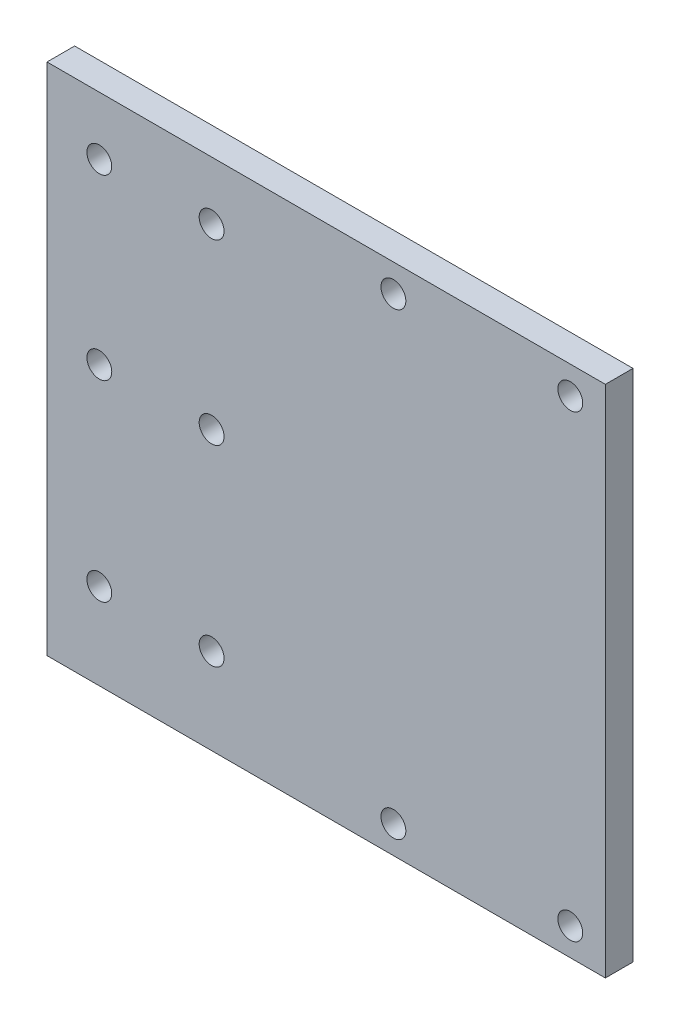
ISO-10303-21;
HEADER;
FILE_DESCRIPTION(('STEP AP214'),'2;1');
FILE_NAME('part.step','',(''),(''),'','','');
FILE_SCHEMA(('AUTOMOTIVE_DESIGN { 1 0 10303 214 1 1 1 1 }'));
ENDSEC;
DATA;
#1=APPLICATION_CONTEXT('core data for automotive mechanical design processes');
#2=APPLICATION_PROTOCOL_DEFINITION('international standard','automotive_design',2000,#1);
#3=PRODUCT_CONTEXT('',#1,'mechanical');
#4=PRODUCT('Part','Part','',(#3));
#5=PRODUCT_RELATED_PRODUCT_CATEGORY('part','',(#4));
#6=PRODUCT_DEFINITION_FORMATION('','',#4);
#7=PRODUCT_DEFINITION_CONTEXT('part definition',#1,'design');
#8=PRODUCT_DEFINITION('design','',#6,#7);
#9=PRODUCT_DEFINITION_SHAPE('','',#8);
#10=(LENGTH_UNIT() NAMED_UNIT(*) SI_UNIT(.MILLI.,.METRE.));
#11=(NAMED_UNIT(*) PLANE_ANGLE_UNIT() SI_UNIT($,.RADIAN.));
#12=(NAMED_UNIT(*) SI_UNIT($,.STERADIAN.) SOLID_ANGLE_UNIT());
#13=UNCERTAINTY_MEASURE_WITH_UNIT(LENGTH_MEASURE(1.E-05),#10,'distance_accuracy_value','');
#14=(GEOMETRIC_REPRESENTATION_CONTEXT(3) GLOBAL_UNCERTAINTY_ASSIGNED_CONTEXT((#13)) GLOBAL_UNIT_ASSIGNED_CONTEXT((#10,
#11,#12)) REPRESENTATION_CONTEXT('',''));
#15=CARTESIAN_POINT('',(0.,0.,0.));
#16=DIRECTION('',(0.,0.,1.));
#17=DIRECTION('',(1.,0.,0.));
#18=AXIS2_PLACEMENT_3D('',#15,#16,#17);
#19=CARTESIAN_POINT('',(0.,0.,5.));
#20=DIRECTION('',(0.,0.,-1.));
#21=DIRECTION('',(-1.,0.,0.));
#22=AXIS2_PLACEMENT_3D('',#19,#20,#21);
#23=PLANE('',#22);
#24=CARTESIAN_POINT('',(-20.7231298925779,-30.9129397601859,5.));
#25=DIRECTION('',(0.,0.,1.));
#26=DIRECTION('',(1.,0.,0.));
#27=AXIS2_PLACEMENT_3D('',#24,#25,#26);
#28=CIRCLE('',#27,2.24999999999999);
#29=CARTESIAN_POINT('',(-18.4731298925779,-30.9129397601859,5.));
#30=VERTEX_POINT('',#29);
#31=EDGE_CURVE('E166',#30,#30,#28,.T.);
#32=ORIENTED_EDGE('',*,*,#31,.F.);
#33=EDGE_LOOP('',(#32));
#34=FACE_BOUND('',#33,.T.);
#35=CARTESIAN_POINT('',(-20.7231298925779,3.80346419902011,5.));
#36=DIRECTION('',(0.,0.,1.));
#37=DIRECTION('',(1.,0.,0.));
#38=AXIS2_PLACEMENT_3D('',#35,#36,#37);
#39=CIRCLE('',#38,2.24999999999999);
#40=CARTESIAN_POINT('',(-18.4731298925779,3.80346419902011,5.));
#41=VERTEX_POINT('',#40);
#42=EDGE_CURVE('E160',#41,#41,#39,.T.);
#43=ORIENTED_EDGE('',*,*,#42,.F.);
#44=EDGE_LOOP('',(#43));
#45=FACE_BOUND('',#44,.T.);
#46=CARTESIAN_POINT('',(-41.0358215426072,3.80346419902011,5.));
#47=DIRECTION('',(0.,0.,1.));
#48=DIRECTION('',(1.,0.,0.));
#49=AXIS2_PLACEMENT_3D('',#46,#47,#48);
#50=CIRCLE('',#49,2.24999999999999);
#51=CARTESIAN_POINT('',(-38.7858215426072,3.80346419902011,5.));
#52=VERTEX_POINT('',#51);
#53=EDGE_CURVE('E154',#52,#52,#50,.T.);
#54=ORIENTED_EDGE('',*,*,#53,.F.);
#55=EDGE_LOOP('',(#54));
#56=FACE_BOUND('',#55,.T.);
#57=CARTESIAN_POINT('',(-41.0358215426072,-30.9129397601859,5.));
#58=DIRECTION('',(0.,0.,1.));
#59=DIRECTION('',(1.,0.,0.));
#60=AXIS2_PLACEMENT_3D('',#57,#58,#59);
#61=CIRCLE('',#60,2.24999999999999);
#62=CARTESIAN_POINT('',(-38.7858215426072,-30.9129397601859,5.));
#63=VERTEX_POINT('',#62);
#64=EDGE_CURVE('E148',#63,#63,#61,.T.);
#65=ORIENTED_EDGE('',*,*,#64,.F.);
#66=EDGE_LOOP('',(#65));
#67=FACE_BOUND('',#66,.T.);
#68=CARTESIAN_POINT('',(-41.0358215426072,35.9837671610475,5.));
#69=DIRECTION('',(0.,0.,1.));
#70=DIRECTION('',(1.,0.,0.));
#71=AXIS2_PLACEMENT_3D('',#68,#69,#70);
#72=CIRCLE('',#71,2.24999999999999);
#73=CARTESIAN_POINT('',(-38.7858215426072,35.9837671610475,5.));
#74=VERTEX_POINT('',#73);
#75=EDGE_CURVE('E142',#74,#74,#72,.T.);
#76=ORIENTED_EDGE('',*,*,#75,.F.);
#77=EDGE_LOOP('',(#76));
#78=FACE_BOUND('',#77,.T.);
#79=CARTESIAN_POINT('',(-20.7231298925779,35.9837671610475,5.));
#80=DIRECTION('',(0.,0.,1.));
#81=DIRECTION('',(1.,0.,0.));
#82=AXIS2_PLACEMENT_3D('',#79,#80,#81);
#83=CIRCLE('',#82,2.24999999999999);
#84=CARTESIAN_POINT('',(-18.4731298925779,35.9837671610475,5.));
#85=VERTEX_POINT('',#84);
#86=EDGE_CURVE('E136',#85,#85,#83,.T.);
#87=ORIENTED_EDGE('',*,*,#86,.F.);
#88=EDGE_LOOP('',(#87));
#89=FACE_BOUND('',#88,.T.);
#90=CARTESIAN_POINT('',(44.1578799463812,41.5000000000011,5.));
#91=DIRECTION('',(0.,0.,1.));
#92=DIRECTION('',(1.,0.,0.));
#93=AXIS2_PLACEMENT_3D('',#90,#91,#92);
#94=CIRCLE('',#93,2.25);
#95=CARTESIAN_POINT('',(46.4078799463812,41.5000000000011,5.));
#96=VERTEX_POINT('',#95);
#97=EDGE_CURVE('E130',#96,#96,#94,.T.);
#98=ORIENTED_EDGE('',*,*,#97,.F.);
#99=EDGE_LOOP('',(#98));
#100=FACE_BOUND('',#99,.T.);
#101=CARTESIAN_POINT('',(12.1578799463812,41.5000000000011,5.));
#102=DIRECTION('',(0.,0.,1.));
#103=DIRECTION('',(1.,0.,0.));
#104=AXIS2_PLACEMENT_3D('',#101,#102,#103);
#105=CIRCLE('',#104,2.25);
#106=CARTESIAN_POINT('',(14.4078799463812,41.5000000000011,5.));
#107=VERTEX_POINT('',#106);
#108=EDGE_CURVE('E124',#107,#107,#105,.T.);
#109=ORIENTED_EDGE('',*,*,#108,.F.);
#110=EDGE_LOOP('',(#109));
#111=FACE_BOUND('',#110,.T.);
#112=CARTESIAN_POINT('',(12.1578799463812,-41.4999999999988,5.));
#113=DIRECTION('',(0.,0.,1.));
#114=DIRECTION('',(1.,0.,0.));
#115=AXIS2_PLACEMENT_3D('',#112,#113,#114);
#116=CIRCLE('',#115,2.25);
#117=CARTESIAN_POINT('',(14.4078799463812,-41.4999999999988,5.));
#118=VERTEX_POINT('',#117);
#119=EDGE_CURVE('E118',#118,#118,#116,.T.);
#120=ORIENTED_EDGE('',*,*,#119,.F.);
#121=EDGE_LOOP('',(#120));
#122=FACE_BOUND('',#121,.T.);
#123=DIRECTION('',(0.,1.,0.));
#124=VECTOR('',#123,1.);
#125=CARTESIAN_POINT('',(50.5,-46.5,5.));
#126=LINE('',#125,#124);
#127=CARTESIAN_POINT('',(50.5,-46.5,5.));
#128=VERTEX_POINT('',#127);
#129=CARTESIAN_POINT('',(50.5,46.5,5.));
#130=VERTEX_POINT('',#129);
#131=EDGE_CURVE('E84',#128,#130,#126,.T.);
#132=ORIENTED_EDGE('',*,*,#131,.T.);
#133=DIRECTION('',(-1.,0.,0.));
#134=VECTOR('',#133,1.);
#135=CARTESIAN_POINT('',(-50.5,46.5,5.));
#136=LINE('',#135,#134);
#137=CARTESIAN_POINT('',(-50.5,46.5,5.));
#138=VERTEX_POINT('',#137);
#139=EDGE_CURVE('E79',#130,#138,#136,.T.);
#140=ORIENTED_EDGE('',*,*,#139,.T.);
#141=DIRECTION('',(0.,-1.,0.));
#142=VECTOR('',#141,1.);
#143=CARTESIAN_POINT('',(-50.5,-46.5,5.));
#144=LINE('',#143,#142);
#145=CARTESIAN_POINT('',(-50.5,-46.5,5.));
#146=VERTEX_POINT('',#145);
#147=EDGE_CURVE('E82',#138,#146,#144,.T.);
#148=ORIENTED_EDGE('',*,*,#147,.T.);
#149=DIRECTION('',(1.,0.,0.));
#150=VECTOR('',#149,1.);
#151=CARTESIAN_POINT('',(-50.5,-46.5,5.));
#152=LINE('',#151,#150);
#153=EDGE_CURVE('E49',#146,#128,#152,.T.);
#154=ORIENTED_EDGE('',*,*,#153,.T.);
#155=EDGE_LOOP('',(#132,#140,#148,#154));
#156=FACE_BOUND('',#155,.T.);
#157=CARTESIAN_POINT('',(44.1578799463812,-41.4999999999988,5.));
#158=DIRECTION('',(0.,0.,1.));
#159=DIRECTION('',(1.,0.,0.));
#160=AXIS2_PLACEMENT_3D('',#157,#158,#159);
#161=CIRCLE('',#160,2.25);
#162=CARTESIAN_POINT('',(46.4078799463812,-41.4999999999988,5.));
#163=VERTEX_POINT('',#162);
#164=EDGE_CURVE('E112',#163,#163,#161,.T.);
#165=ORIENTED_EDGE('',*,*,#164,.F.);
#166=EDGE_LOOP('',(#165));
#167=FACE_BOUND('',#166,.T.);
#168=ADVANCED_FACE('F32',(#34,#45,#56,#67,#78,#89,#100,#111,#122,#156,#167),#23,.F.);
#169=CARTESIAN_POINT('',(50.5,-46.5,5.));
#170=DIRECTION('',(-1.,0.,0.));
#171=DIRECTION('',(0.,0.,1.));
#172=AXIS2_PLACEMENT_3D('',#169,#170,#171);
#173=PLANE('',#172);
#174=DIRECTION('',(0.,1.,0.));
#175=VECTOR('',#174,1.);
#176=CARTESIAN_POINT('',(50.5,-46.5,0.));
#177=LINE('',#176,#175);
#178=CARTESIAN_POINT('',(50.5,-46.5,0.));
#179=VERTEX_POINT('',#178);
#180=CARTESIAN_POINT('',(50.5,46.5,0.));
#181=VERTEX_POINT('',#180);
#182=EDGE_CURVE('E96',#179,#181,#177,.T.);
#183=ORIENTED_EDGE('',*,*,#182,.T.);
#184=DIRECTION('',(0.,0.,-1.));
#185=VECTOR('',#184,1.);
#186=CARTESIAN_POINT('',(50.5,46.5,5.));
#187=LINE('',#186,#185);
#188=EDGE_CURVE('E11',#130,#181,#187,.T.);
#189=ORIENTED_EDGE('',*,*,#188,.F.);
#190=ORIENTED_EDGE('',*,*,#131,.F.);
#191=DIRECTION('',(0.,0.,-1.));
#192=VECTOR('',#191,1.);
#193=CARTESIAN_POINT('',(50.5,-46.5,5.));
#194=LINE('',#193,#192);
#195=EDGE_CURVE('E92',#128,#179,#194,.T.);
#196=ORIENTED_EDGE('',*,*,#195,.T.);
#197=EDGE_LOOP('',(#183,#189,#190,#196));
#198=FACE_BOUND('',#197,.T.);
#199=ADVANCED_FACE('F34',(#198),#173,.F.);
#200=CARTESIAN_POINT('',(-50.5,46.5,5.));
#201=DIRECTION('',(0.,-1.,0.));
#202=DIRECTION('',(0.,0.,-1.));
#203=AXIS2_PLACEMENT_3D('',#200,#201,#202);
#204=PLANE('',#203);
#205=DIRECTION('',(-1.,0.,0.));
#206=VECTOR('',#205,1.);
#207=CARTESIAN_POINT('',(-50.5,46.5,0.));
#208=LINE('',#207,#206);
#209=CARTESIAN_POINT('',(-50.5,46.5,0.));
#210=VERTEX_POINT('',#209);
#211=EDGE_CURVE('E88',#181,#210,#208,.T.);
#212=ORIENTED_EDGE('',*,*,#211,.T.);
#213=DIRECTION('',(0.,0.,-1.));
#214=VECTOR('',#213,1.);
#215=CARTESIAN_POINT('',(-50.5,46.5,5.));
#216=LINE('',#215,#214);
#217=EDGE_CURVE('E41',#138,#210,#216,.T.);
#218=ORIENTED_EDGE('',*,*,#217,.F.);
#219=ORIENTED_EDGE('',*,*,#139,.F.);
#220=ORIENTED_EDGE('',*,*,#188,.T.);
#221=EDGE_LOOP('',(#212,#218,#219,#220));
#222=FACE_BOUND('',#221,.T.);
#223=ADVANCED_FACE('F87',(#222),#204,.F.);
#224=CARTESIAN_POINT('',(-50.5,-46.5,5.));
#225=DIRECTION('',(1.,0.,0.));
#226=DIRECTION('',(0.,0.,-1.));
#227=AXIS2_PLACEMENT_3D('',#224,#225,#226);
#228=PLANE('',#227);
#229=DIRECTION('',(0.,-1.,0.));
#230=VECTOR('',#229,1.);
#231=CARTESIAN_POINT('',(-50.5,-46.5,0.));
#232=LINE('',#231,#230);
#233=CARTESIAN_POINT('',(-50.5,-46.5,0.));
#234=VERTEX_POINT('',#233);
#235=EDGE_CURVE('E66',#210,#234,#232,.T.);
#236=ORIENTED_EDGE('',*,*,#235,.T.);
#237=DIRECTION('',(0.,0.,-1.));
#238=VECTOR('',#237,1.);
#239=CARTESIAN_POINT('',(-50.5,-46.5,5.));
#240=LINE('',#239,#238);
#241=EDGE_CURVE('E89',#146,#234,#240,.T.);
#242=ORIENTED_EDGE('',*,*,#241,.F.);
#243=ORIENTED_EDGE('',*,*,#147,.F.);
#244=ORIENTED_EDGE('',*,*,#217,.T.);
#245=EDGE_LOOP('',(#236,#242,#243,#244));
#246=FACE_BOUND('',#245,.T.);
#247=ADVANCED_FACE('F90',(#246),#228,.F.);
#248=CARTESIAN_POINT('',(-50.5,-46.5,5.));
#249=DIRECTION('',(0.,1.,0.));
#250=DIRECTION('',(0.,0.,1.));
#251=AXIS2_PLACEMENT_3D('',#248,#249,#250);
#252=PLANE('',#251);
#253=DIRECTION('',(1.,0.,0.));
#254=VECTOR('',#253,1.);
#255=CARTESIAN_POINT('',(-50.5,-46.5,0.));
#256=LINE('',#255,#254);
#257=EDGE_CURVE('E72',#234,#179,#256,.T.);
#258=ORIENTED_EDGE('',*,*,#257,.T.);
#259=ORIENTED_EDGE('',*,*,#195,.F.);
#260=ORIENTED_EDGE('',*,*,#153,.F.);
#261=ORIENTED_EDGE('',*,*,#241,.T.);
#262=EDGE_LOOP('',(#258,#259,#260,#261));
#263=FACE_BOUND('',#262,.T.);
#264=ADVANCED_FACE('F104',(#263),#252,.F.);
#265=CARTESIAN_POINT('',(0.,0.,0.));
#266=DIRECTION('',(0.,0.,-1.));
#267=DIRECTION('',(-1.,0.,0.));
#268=AXIS2_PLACEMENT_3D('',#265,#266,#267);
#269=PLANE('',#268);
#270=CARTESIAN_POINT('',(-20.7231298925779,-30.9129397601859,0.));
#271=DIRECTION('',(0.,0.,1.));
#272=DIRECTION('',(1.,0.,0.));
#273=AXIS2_PLACEMENT_3D('',#270,#271,#272);
#274=CIRCLE('',#273,2.25);
#275=CARTESIAN_POINT('',(-18.4731298925779,-30.9129397601859,0.));
#276=VERTEX_POINT('',#275);
#277=EDGE_CURVE('E163',#276,#276,#274,.T.);
#278=ORIENTED_EDGE('',*,*,#277,.T.);
#279=EDGE_LOOP('',(#278));
#280=FACE_BOUND('',#279,.T.);
#281=CARTESIAN_POINT('',(-20.7231298925779,3.80346419902011,0.));
#282=DIRECTION('',(0.,0.,1.));
#283=DIRECTION('',(1.,0.,0.));
#284=AXIS2_PLACEMENT_3D('',#281,#282,#283);
#285=CIRCLE('',#284,2.25);
#286=CARTESIAN_POINT('',(-18.4731298925779,3.80346419902011,0.));
#287=VERTEX_POINT('',#286);
#288=EDGE_CURVE('E157',#287,#287,#285,.T.);
#289=ORIENTED_EDGE('',*,*,#288,.T.);
#290=EDGE_LOOP('',(#289));
#291=FACE_BOUND('',#290,.T.);
#292=CARTESIAN_POINT('',(-41.0358215426072,3.80346419902011,0.));
#293=DIRECTION('',(0.,0.,1.));
#294=DIRECTION('',(1.,0.,0.));
#295=AXIS2_PLACEMENT_3D('',#292,#293,#294);
#296=CIRCLE('',#295,2.25);
#297=CARTESIAN_POINT('',(-38.7858215426072,3.80346419902011,0.));
#298=VERTEX_POINT('',#297);
#299=EDGE_CURVE('E151',#298,#298,#296,.T.);
#300=ORIENTED_EDGE('',*,*,#299,.T.);
#301=EDGE_LOOP('',(#300));
#302=FACE_BOUND('',#301,.T.);
#303=CARTESIAN_POINT('',(-41.0358215426072,-30.9129397601859,0.));
#304=DIRECTION('',(0.,0.,1.));
#305=DIRECTION('',(1.,0.,0.));
#306=AXIS2_PLACEMENT_3D('',#303,#304,#305);
#307=CIRCLE('',#306,2.25);
#308=CARTESIAN_POINT('',(-38.7858215426072,-30.9129397601859,0.));
#309=VERTEX_POINT('',#308);
#310=EDGE_CURVE('E145',#309,#309,#307,.T.);
#311=ORIENTED_EDGE('',*,*,#310,.T.);
#312=EDGE_LOOP('',(#311));
#313=FACE_BOUND('',#312,.T.);
#314=CARTESIAN_POINT('',(-41.0358215426072,35.9837671610475,0.));
#315=DIRECTION('',(0.,0.,1.));
#316=DIRECTION('',(1.,0.,0.));
#317=AXIS2_PLACEMENT_3D('',#314,#315,#316);
#318=CIRCLE('',#317,2.25);
#319=CARTESIAN_POINT('',(-38.7858215426072,35.9837671610475,0.));
#320=VERTEX_POINT('',#319);
#321=EDGE_CURVE('E139',#320,#320,#318,.T.);
#322=ORIENTED_EDGE('',*,*,#321,.T.);
#323=EDGE_LOOP('',(#322));
#324=FACE_BOUND('',#323,.T.);
#325=CARTESIAN_POINT('',(-20.7231298925779,35.9837671610475,0.));
#326=DIRECTION('',(0.,0.,1.));
#327=DIRECTION('',(1.,0.,0.));
#328=AXIS2_PLACEMENT_3D('',#325,#326,#327);
#329=CIRCLE('',#328,2.25);
#330=CARTESIAN_POINT('',(-18.4731298925779,35.9837671610475,0.));
#331=VERTEX_POINT('',#330);
#332=EDGE_CURVE('E133',#331,#331,#329,.T.);
#333=ORIENTED_EDGE('',*,*,#332,.T.);
#334=EDGE_LOOP('',(#333));
#335=FACE_BOUND('',#334,.T.);
#336=CARTESIAN_POINT('',(44.1578799463812,41.5000000000011,0.));
#337=DIRECTION('',(0.,0.,1.));
#338=DIRECTION('',(1.,0.,0.));
#339=AXIS2_PLACEMENT_3D('',#336,#337,#338);
#340=CIRCLE('',#339,2.25);
#341=CARTESIAN_POINT('',(46.4078799463812,41.5000000000011,0.));
#342=VERTEX_POINT('',#341);
#343=EDGE_CURVE('E127',#342,#342,#340,.T.);
#344=ORIENTED_EDGE('',*,*,#343,.T.);
#345=EDGE_LOOP('',(#344));
#346=FACE_BOUND('',#345,.T.);
#347=CARTESIAN_POINT('',(12.1578799463812,41.5000000000011,0.));
#348=DIRECTION('',(0.,0.,1.));
#349=DIRECTION('',(1.,0.,0.));
#350=AXIS2_PLACEMENT_3D('',#347,#348,#349);
#351=CIRCLE('',#350,2.25);
#352=CARTESIAN_POINT('',(14.4078799463812,41.5000000000011,0.));
#353=VERTEX_POINT('',#352);
#354=EDGE_CURVE('E121',#353,#353,#351,.T.);
#355=ORIENTED_EDGE('',*,*,#354,.T.);
#356=EDGE_LOOP('',(#355));
#357=FACE_BOUND('',#356,.T.);
#358=CARTESIAN_POINT('',(12.1578799463812,-41.4999999999988,0.));
#359=DIRECTION('',(0.,0.,1.));
#360=DIRECTION('',(1.,0.,0.));
#361=AXIS2_PLACEMENT_3D('',#358,#359,#360);
#362=CIRCLE('',#361,2.25);
#363=CARTESIAN_POINT('',(14.4078799463812,-41.4999999999988,0.));
#364=VERTEX_POINT('',#363);
#365=EDGE_CURVE('E115',#364,#364,#362,.T.);
#366=ORIENTED_EDGE('',*,*,#365,.T.);
#367=EDGE_LOOP('',(#366));
#368=FACE_BOUND('',#367,.T.);
#369=CARTESIAN_POINT('',(44.1578799463812,-41.4999999999988,0.));
#370=DIRECTION('',(0.,0.,1.));
#371=DIRECTION('',(1.,0.,0.));
#372=AXIS2_PLACEMENT_3D('',#369,#370,#371);
#373=CIRCLE('',#372,2.25);
#374=CARTESIAN_POINT('',(46.4078799463812,-41.4999999999988,0.));
#375=VERTEX_POINT('',#374);
#376=EDGE_CURVE('E99',#375,#375,#373,.T.);
#377=ORIENTED_EDGE('',*,*,#376,.T.);
#378=EDGE_LOOP('',(#377));
#379=FACE_BOUND('',#378,.T.);
#380=ORIENTED_EDGE('',*,*,#182,.F.);
#381=ORIENTED_EDGE('',*,*,#257,.F.);
#382=ORIENTED_EDGE('',*,*,#235,.F.);
#383=ORIENTED_EDGE('',*,*,#211,.F.);
#384=EDGE_LOOP('',(#380,#381,#382,#383));
#385=FACE_BOUND('',#384,.T.);
#386=ADVANCED_FACE('F107',(#280,#291,#302,#313,#324,#335,#346,#357,#368,#379,#385),#269,.T.);
#387=CARTESIAN_POINT('',(44.1578799463812,-41.4999999999988,5.));
#388=DIRECTION('',(0.,0.,1.));
#389=DIRECTION('',(1.,0.,0.));
#390=AXIS2_PLACEMENT_3D('',#387,#388,#389);
#391=CYLINDRICAL_SURFACE('',#390,2.25);
#392=ORIENTED_EDGE('',*,*,#376,.F.);
#393=EDGE_LOOP('',(#392));
#394=FACE_BOUND('',#393,.T.);
#395=ORIENTED_EDGE('',*,*,#164,.T.);
#396=EDGE_LOOP('',(#395));
#397=FACE_BOUND('',#396,.T.);
#398=ADVANCED_FACE('F194',(#394,#397),#391,.F.);
#399=CARTESIAN_POINT('',(12.1578799463812,-41.4999999999988,5.));
#400=DIRECTION('',(0.,0.,1.));
#401=DIRECTION('',(1.,0.,0.));
#402=AXIS2_PLACEMENT_3D('',#399,#400,#401);
#403=CYLINDRICAL_SURFACE('',#402,2.25);
#404=ORIENTED_EDGE('',*,*,#365,.F.);
#405=EDGE_LOOP('',(#404));
#406=FACE_BOUND('',#405,.T.);
#407=ORIENTED_EDGE('',*,*,#119,.T.);
#408=EDGE_LOOP('',(#407));
#409=FACE_BOUND('',#408,.T.);
#410=ADVANCED_FACE('F191',(#406,#409),#403,.F.);
#411=CARTESIAN_POINT('',(12.1578799463812,41.5000000000011,5.));
#412=DIRECTION('',(0.,0.,1.));
#413=DIRECTION('',(1.,0.,0.));
#414=AXIS2_PLACEMENT_3D('',#411,#412,#413);
#415=CYLINDRICAL_SURFACE('',#414,2.25);
#416=ORIENTED_EDGE('',*,*,#354,.F.);
#417=EDGE_LOOP('',(#416));
#418=FACE_BOUND('',#417,.T.);
#419=ORIENTED_EDGE('',*,*,#108,.T.);
#420=EDGE_LOOP('',(#419));
#421=FACE_BOUND('',#420,.T.);
#422=ADVANCED_FACE('F193',(#418,#421),#415,.F.);
#423=CARTESIAN_POINT('',(44.1578799463812,41.5000000000011,5.));
#424=DIRECTION('',(0.,0.,1.));
#425=DIRECTION('',(1.,0.,0.));
#426=AXIS2_PLACEMENT_3D('',#423,#424,#425);
#427=CYLINDRICAL_SURFACE('',#426,2.25);
#428=ORIENTED_EDGE('',*,*,#343,.F.);
#429=EDGE_LOOP('',(#428));
#430=FACE_BOUND('',#429,.T.);
#431=ORIENTED_EDGE('',*,*,#97,.T.);
#432=EDGE_LOOP('',(#431));
#433=FACE_BOUND('',#432,.T.);
#434=ADVANCED_FACE('F201',(#430,#433),#427,.F.);
#435=CARTESIAN_POINT('',(-20.7231298925779,35.9837671610475,5.));
#436=DIRECTION('',(0.,0.,1.));
#437=DIRECTION('',(1.,0.,0.));
#438=AXIS2_PLACEMENT_3D('',#435,#436,#437);
#439=CYLINDRICAL_SURFACE('',#438,2.24999999999999);
#440=ORIENTED_EDGE('',*,*,#332,.F.);
#441=EDGE_LOOP('',(#440));
#442=FACE_BOUND('',#441,.T.);
#443=ORIENTED_EDGE('',*,*,#86,.T.);
#444=EDGE_LOOP('',(#443));
#445=FACE_BOUND('',#444,.T.);
#446=ADVANCED_FACE('F243',(#442,#445),#439,.F.);
#447=CARTESIAN_POINT('',(-41.0358215426072,35.9837671610475,5.));
#448=DIRECTION('',(0.,0.,1.));
#449=DIRECTION('',(1.,0.,0.));
#450=AXIS2_PLACEMENT_3D('',#447,#448,#449);
#451=CYLINDRICAL_SURFACE('',#450,2.25);
#452=ORIENTED_EDGE('',*,*,#321,.F.);
#453=EDGE_LOOP('',(#452));
#454=FACE_BOUND('',#453,.T.);
#455=ORIENTED_EDGE('',*,*,#75,.T.);
#456=EDGE_LOOP('',(#455));
#457=FACE_BOUND('',#456,.T.);
#458=ADVANCED_FACE('F248',(#454,#457),#451,.F.);
#459=CARTESIAN_POINT('',(-41.0358215426072,-30.9129397601859,5.));
#460=DIRECTION('',(0.,0.,1.));
#461=DIRECTION('',(1.,0.,0.));
#462=AXIS2_PLACEMENT_3D('',#459,#460,#461);
#463=CYLINDRICAL_SURFACE('',#462,2.25);
#464=ORIENTED_EDGE('',*,*,#310,.F.);
#465=EDGE_LOOP('',(#464));
#466=FACE_BOUND('',#465,.T.);
#467=ORIENTED_EDGE('',*,*,#64,.T.);
#468=EDGE_LOOP('',(#467));
#469=FACE_BOUND('',#468,.T.);
#470=ADVANCED_FACE('F258',(#466,#469),#463,.F.);
#471=CARTESIAN_POINT('',(-41.0358215426072,3.80346419902011,5.));
#472=DIRECTION('',(0.,0.,1.));
#473=DIRECTION('',(1.,0.,0.));
#474=AXIS2_PLACEMENT_3D('',#471,#472,#473);
#475=CYLINDRICAL_SURFACE('',#474,2.25);
#476=ORIENTED_EDGE('',*,*,#299,.F.);
#477=EDGE_LOOP('',(#476));
#478=FACE_BOUND('',#477,.T.);
#479=ORIENTED_EDGE('',*,*,#53,.T.);
#480=EDGE_LOOP('',(#479));
#481=FACE_BOUND('',#480,.T.);
#482=ADVANCED_FACE('F268',(#478,#481),#475,.F.);
#483=CARTESIAN_POINT('',(-20.7231298925779,3.80346419902011,5.));
#484=DIRECTION('',(0.,0.,1.));
#485=DIRECTION('',(1.,0.,0.));
#486=AXIS2_PLACEMENT_3D('',#483,#484,#485);
#487=CYLINDRICAL_SURFACE('',#486,2.24999999999999);
#488=ORIENTED_EDGE('',*,*,#288,.F.);
#489=EDGE_LOOP('',(#488));
#490=FACE_BOUND('',#489,.T.);
#491=ORIENTED_EDGE('',*,*,#42,.T.);
#492=EDGE_LOOP('',(#491));
#493=FACE_BOUND('',#492,.T.);
#494=ADVANCED_FACE('F278',(#490,#493),#487,.F.);
#495=CARTESIAN_POINT('',(-20.7231298925779,-30.9129397601859,5.));
#496=DIRECTION('',(0.,0.,1.));
#497=DIRECTION('',(1.,0.,0.));
#498=AXIS2_PLACEMENT_3D('',#495,#496,#497);
#499=CYLINDRICAL_SURFACE('',#498,2.24999999999999);
#500=ORIENTED_EDGE('',*,*,#277,.F.);
#501=EDGE_LOOP('',(#500));
#502=FACE_BOUND('',#501,.T.);
#503=ORIENTED_EDGE('',*,*,#31,.T.);
#504=EDGE_LOOP('',(#503));
#505=FACE_BOUND('',#504,.T.);
#506=ADVANCED_FACE('F170',(#502,#505),#499,.F.);
#507=CLOSED_SHELL('',(#168,#199,#223,#247,#264,#386,#398,#410,#422,#434,#446,#458,#470,#482,
#494,#506));
#508=MANIFOLD_SOLID_BREP('B2',#507);
#509=ADVANCED_BREP_SHAPE_REPRESENTATION('',(#18,#508),#14);
#510=SHAPE_DEFINITION_REPRESENTATION(#9,#509);
ENDSEC;
END-ISO-10303-21;
